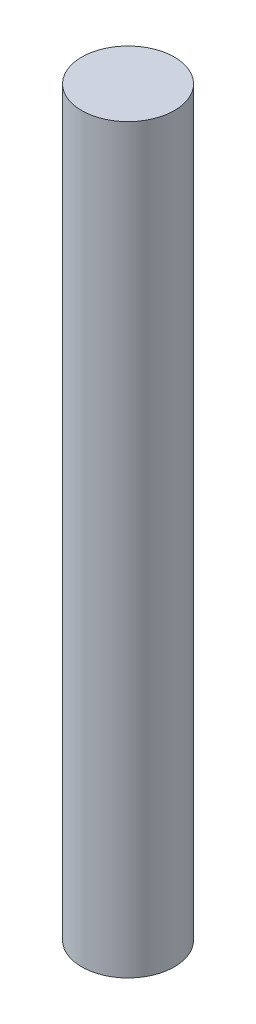
ISO-10303-21;
HEADER;
FILE_DESCRIPTION(('STEP AP214'),'2;1');
FILE_NAME('part.step','',(''),(''),'','','');
FILE_SCHEMA(('AUTOMOTIVE_DESIGN { 1 0 10303 214 1 1 1 1 }'));
ENDSEC;
DATA;
#1=APPLICATION_CONTEXT('core data for automotive mechanical design processes');
#2=APPLICATION_PROTOCOL_DEFINITION('international standard','automotive_design',2000,#1);
#3=PRODUCT_CONTEXT('',#1,'mechanical');
#4=PRODUCT('Part','Part','',(#3));
#5=PRODUCT_RELATED_PRODUCT_CATEGORY('part','',(#4));
#6=PRODUCT_DEFINITION_FORMATION('','',#4);
#7=PRODUCT_DEFINITION_CONTEXT('part definition',#1,'design');
#8=PRODUCT_DEFINITION('design','',#6,#7);
#9=PRODUCT_DEFINITION_SHAPE('','',#8);
#10=(LENGTH_UNIT() NAMED_UNIT(*) SI_UNIT(.MILLI.,.METRE.));
#11=(NAMED_UNIT(*) PLANE_ANGLE_UNIT() SI_UNIT($,.RADIAN.));
#12=(NAMED_UNIT(*) SI_UNIT($,.STERADIAN.) SOLID_ANGLE_UNIT());
#13=UNCERTAINTY_MEASURE_WITH_UNIT(LENGTH_MEASURE(1.E-05),#10,'distance_accuracy_value','');
#14=(GEOMETRIC_REPRESENTATION_CONTEXT(3) GLOBAL_UNCERTAINTY_ASSIGNED_CONTEXT((#13)) GLOBAL_UNIT_ASSIGNED_CONTEXT((#10,
#11,#12)) REPRESENTATION_CONTEXT('',''));
#15=CARTESIAN_POINT('',(0.,0.,0.));
#16=DIRECTION('',(0.,0.,1.));
#17=DIRECTION('',(1.,0.,0.));
#18=AXIS2_PLACEMENT_3D('',#15,#16,#17);
#19=CARTESIAN_POINT('',(0.,19.05,0.));
#20=DIRECTION('',(0.,-1.,0.));
#21=DIRECTION('',(0.,0.,-1.));
#22=AXIS2_PLACEMENT_3D('',#19,#20,#21);
#23=CYLINDRICAL_SURFACE('',#22,2.38125);
#24=CARTESIAN_POINT('',(0.,19.05,0.));
#25=DIRECTION('',(0.,1.,0.));
#26=DIRECTION('',(0.,0.,1.));
#27=AXIS2_PLACEMENT_3D('',#24,#25,#26);
#28=CIRCLE('',#27,2.38125);
#29=CARTESIAN_POINT('',(0.,19.05,-2.38125));
#30=VERTEX_POINT('',#29);
#31=EDGE_CURVE('E10',#30,#30,#28,.T.);
#32=CARTESIAN_POINT('',(0.,-19.05,0.));
#33=DIRECTION('',(0.,1.,0.));
#34=DIRECTION('',(0.,0.,1.));
#35=AXIS2_PLACEMENT_3D('',#32,#33,#34);
#36=CIRCLE('',#35,2.38125);
#37=CARTESIAN_POINT('',(0.,-19.05,-2.38125));
#38=VERTEX_POINT('',#37);
#39=EDGE_CURVE('E40',#38,#38,#36,.T.);
#40=CARTESIAN_POINT('',(0.,19.05,-2.38125));
#41=CARTESIAN_POINT('',(0.,18.653125,-2.38125));
#42=CARTESIAN_POINT('',(0.,18.25625,-2.38125));
#43=CARTESIAN_POINT('',(0.,17.4625,-2.38125));
#44=CARTESIAN_POINT('',(0.,17.065625,-2.38125));
#45=CARTESIAN_POINT('',(0.,16.271875,-2.38125));
#46=CARTESIAN_POINT('',(0.,15.875,-2.38125));
#47=CARTESIAN_POINT('',(0.,15.08125,-2.38125));
#48=CARTESIAN_POINT('',(0.,14.684375,-2.38125));
#49=CARTESIAN_POINT('',(0.,13.890625,-2.38125));
#50=CARTESIAN_POINT('',(0.,13.49375,-2.38125));
#51=CARTESIAN_POINT('',(0.,12.7,-2.38125));
#52=CARTESIAN_POINT('',(0.,12.303125,-2.38125));
#53=CARTESIAN_POINT('',(0.,11.509375,-2.38125));
#54=CARTESIAN_POINT('',(0.,11.1125,-2.38125));
#55=CARTESIAN_POINT('',(0.,10.31875,-2.38125));
#56=CARTESIAN_POINT('',(0.,9.921875,-2.38125));
#57=CARTESIAN_POINT('',(0.,9.128125,-2.38125));
#58=CARTESIAN_POINT('',(0.,8.73125,-2.38125));
#59=CARTESIAN_POINT('',(0.,7.9375,-2.38125));
#60=CARTESIAN_POINT('',(0.,7.540625,-2.38125));
#61=CARTESIAN_POINT('',(0.,6.746875,-2.38125));
#62=CARTESIAN_POINT('',(0.,6.35,-2.38125));
#63=CARTESIAN_POINT('',(0.,5.55625,-2.38125));
#64=CARTESIAN_POINT('',(0.,5.159375,-2.38125));
#65=CARTESIAN_POINT('',(0.,4.365625,-2.38125));
#66=CARTESIAN_POINT('',(0.,3.96875,-2.38125));
#67=CARTESIAN_POINT('',(0.,3.175,-2.38125));
#68=CARTESIAN_POINT('',(0.,2.778125,-2.38125));
#69=CARTESIAN_POINT('',(0.,1.984375,-2.38125));
#70=CARTESIAN_POINT('',(0.,1.5875,-2.38125));
#71=CARTESIAN_POINT('',(0.,0.79375,-2.38125));
#72=CARTESIAN_POINT('',(0.,0.396875,-2.38125));
#73=CARTESIAN_POINT('',(0.,-0.396875,-2.38125));
#74=CARTESIAN_POINT('',(0.,-0.79375,-2.38125));
#75=CARTESIAN_POINT('',(0.,-1.5875,-2.38125));
#76=CARTESIAN_POINT('',(0.,-1.984375,-2.38125));
#77=CARTESIAN_POINT('',(0.,-2.778125,-2.38125));
#78=CARTESIAN_POINT('',(0.,-3.175,-2.38125));
#79=CARTESIAN_POINT('',(0.,-3.96875,-2.38125));
#80=CARTESIAN_POINT('',(0.,-4.365625,-2.38125));
#81=CARTESIAN_POINT('',(0.,-5.159375,-2.38125));
#82=CARTESIAN_POINT('',(0.,-5.55625,-2.38125));
#83=CARTESIAN_POINT('',(0.,-6.35,-2.38125));
#84=CARTESIAN_POINT('',(0.,-6.746875,-2.38125));
#85=CARTESIAN_POINT('',(0.,-7.540625,-2.38125));
#86=CARTESIAN_POINT('',(0.,-7.9375,-2.38125));
#87=CARTESIAN_POINT('',(0.,-8.73125,-2.38125));
#88=CARTESIAN_POINT('',(0.,-9.128125,-2.38125));
#89=CARTESIAN_POINT('',(0.,-9.921875,-2.38125));
#90=CARTESIAN_POINT('',(0.,-10.31875,-2.38125));
#91=CARTESIAN_POINT('',(0.,-11.1125,-2.38125));
#92=CARTESIAN_POINT('',(0.,-11.509375,-2.38125));
#93=CARTESIAN_POINT('',(0.,-12.303125,-2.38125));
#94=CARTESIAN_POINT('',(0.,-12.7,-2.38125));
#95=CARTESIAN_POINT('',(0.,-13.49375,-2.38125));
#96=CARTESIAN_POINT('',(0.,-13.890625,-2.38125));
#97=CARTESIAN_POINT('',(0.,-14.684375,-2.38125));
#98=CARTESIAN_POINT('',(0.,-15.08125,-2.38125));
#99=CARTESIAN_POINT('',(0.,-15.875,-2.38125));
#100=CARTESIAN_POINT('',(0.,-16.271875,-2.38125));
#101=CARTESIAN_POINT('',(0.,-17.065625,-2.38125));
#102=CARTESIAN_POINT('',(0.,-17.4625,-2.38125));
#103=CARTESIAN_POINT('',(0.,-18.25625,-2.38125));
#104=CARTESIAN_POINT('',(0.,-18.653125,-2.38125));
#105=CARTESIAN_POINT('',(0.,-19.05,-2.38125));
#106=B_SPLINE_CURVE_WITH_KNOTS('',3,(#40,#41,#42,#43,#44,#45,#46,#47,#48,#49,#50,#51,#52,#53,
#54,#55,#56,#57,#58,#59,#60,#61,#62,#63,#64,#65,#66,#67,#68,#69,#70,#71,#72,#73,#74,#75,#76,#77,
#78,#79,#80,#81,#82,#83,#84,#85,#86,#87,#88,#89,#90,#91,#92,#93,#94,#95,#96,#97,#98,#99,#100,
#101,#102,#103,#104,#105),.UNSPECIFIED.,.F.,.F.,(4,2,2,2,2,2,2,2,2,2,2,2,2,2,2,2,2,2,2,2,2,2,2,
2,2,2,2,2,2,2,2,2,4),(0.,1.190625,2.38125,3.571875,4.7625,5.953125,7.14375,8.334375,9.525,
10.715625,11.90625,13.096875,14.2875,15.478125,16.66875,17.859375,19.05,20.240625,21.43125,
22.621875,23.8125,25.003125,26.19375,27.384375,28.575,29.765625,30.95625,32.146875,33.3375,
34.528125,35.71875,36.909375,38.1),.UNSPECIFIED.);
#107=EDGE_CURVE('BSEAM37',#30,#38,#106,.T.);
#108=ORIENTED_EDGE('',*,*,#31,.F.);
#109=ORIENTED_EDGE('',*,*,#39,.T.);
#110=ORIENTED_EDGE('',*,*,#107,.T.);
#111=ORIENTED_EDGE('',*,*,#107,.F.);
#112=EDGE_LOOP('',(#108,#110,#109,#111));
#113=FACE_BOUND('',#112,.T.);
#114=ADVANCED_FACE('F37',(#113),#23,.T.);
#115=CARTESIAN_POINT('',(0.,19.05,0.));
#116=DIRECTION('',(0.,1.,0.));
#117=DIRECTION('',(0.,0.,1.));
#118=AXIS2_PLACEMENT_3D('',#115,#116,#117);
#119=PLANE('',#118);
#120=ORIENTED_EDGE('',*,*,#31,.T.);
#121=EDGE_LOOP('',(#120));
#122=FACE_BOUND('',#121,.T.);
#123=ADVANCED_FACE('F54',(#122),#119,.T.);
#124=CARTESIAN_POINT('',(0.,-19.05,0.));
#125=DIRECTION('',(0.,1.,0.));
#126=DIRECTION('',(0.,0.,1.));
#127=AXIS2_PLACEMENT_3D('',#124,#125,#126);
#128=PLANE('',#127);
#129=ORIENTED_EDGE('',*,*,#39,.F.);
#130=EDGE_LOOP('',(#129));
#131=FACE_BOUND('',#130,.T.);
#132=ADVANCED_FACE('F52',(#131),#128,.F.);
#133=CLOSED_SHELL('',(#114,#123,#132));
#134=MANIFOLD_SOLID_BREP('B2',#133);
#135=ADVANCED_BREP_SHAPE_REPRESENTATION('',(#18,#134),#14);
#136=SHAPE_DEFINITION_REPRESENTATION(#9,#135);
ENDSEC;
END-ISO-10303-21;
